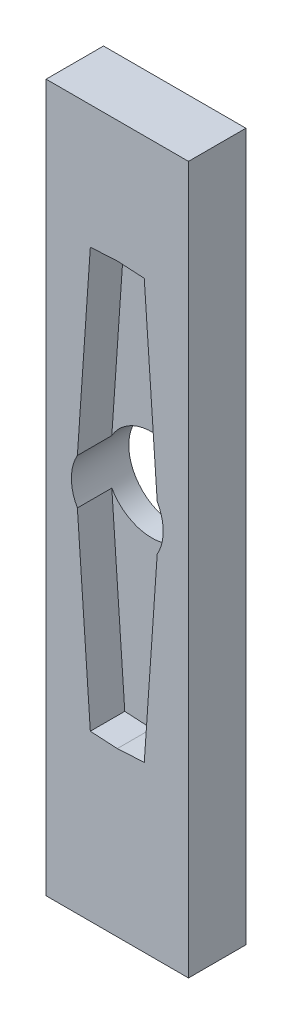
ISO-10303-21;
HEADER;
FILE_DESCRIPTION(('STEP AP214'),'2;1');
FILE_NAME('part.step','',(''),(''),'','','');
FILE_SCHEMA(('AUTOMOTIVE_DESIGN { 1 0 10303 214 1 1 1 1 }'));
ENDSEC;
DATA;
#1=APPLICATION_CONTEXT('core data for automotive mechanical design processes');
#2=APPLICATION_PROTOCOL_DEFINITION('international standard','automotive_design',2000,#1);
#3=PRODUCT_CONTEXT('',#1,'mechanical');
#4=PRODUCT('Part','Part','',(#3));
#5=PRODUCT_RELATED_PRODUCT_CATEGORY('part','',(#4));
#6=PRODUCT_DEFINITION_FORMATION('','',#4);
#7=PRODUCT_DEFINITION_CONTEXT('part definition',#1,'design');
#8=PRODUCT_DEFINITION('design','',#6,#7);
#9=PRODUCT_DEFINITION_SHAPE('','',#8);
#10=(LENGTH_UNIT() NAMED_UNIT(*) SI_UNIT(.MILLI.,.METRE.));
#11=(NAMED_UNIT(*) PLANE_ANGLE_UNIT() SI_UNIT($,.RADIAN.));
#12=(NAMED_UNIT(*) SI_UNIT($,.STERADIAN.) SOLID_ANGLE_UNIT());
#13=UNCERTAINTY_MEASURE_WITH_UNIT(LENGTH_MEASURE(1.E-05),#10,'distance_accuracy_value','');
#14=(GEOMETRIC_REPRESENTATION_CONTEXT(3) GLOBAL_UNCERTAINTY_ASSIGNED_CONTEXT((#13)) GLOBAL_UNIT_ASSIGNED_CONTEXT((#10,
#11,#12)) REPRESENTATION_CONTEXT('',''));
#15=CARTESIAN_POINT('',(0.,0.,0.));
#16=DIRECTION('',(0.,0.,1.));
#17=DIRECTION('',(1.,0.,0.));
#18=AXIS2_PLACEMENT_3D('',#15,#16,#17);
#19=CARTESIAN_POINT('',(0.,0.,-3.));
#20=DIRECTION('',(0.,0.,-1.));
#21=DIRECTION('',(-1.,0.,0.));
#22=AXIS2_PLACEMENT_3D('',#19,#20,#21);
#23=PLANE('',#22);
#24=DIRECTION('',(-0.0691677978064663,-0.997605039956497,0.));
#25=VECTOR('',#24,1.);
#26=CARTESIAN_POINT('',(-3.61380799217099,0.,-3.));
#27=LINE('',#26,#25);
#28=CARTESIAN_POINT('',(-2.34820149974734,18.2538038723774,-3.));
#29=VERTEX_POINT('',#28);
#30=CARTESIAN_POINT('',(-3.47665940987879,1.97808982296084,-3.));
#31=VERTEX_POINT('',#30);
#32=EDGE_CURVE('E319',#29,#31,#27,.T.);
#33=ORIENTED_EDGE('',*,*,#32,.T.);
#34=CARTESIAN_POINT('',(0.,0.,-3.));
#35=DIRECTION('',(0.,0.,-1.));
#36=DIRECTION('',(-1.,0.,0.));
#37=AXIS2_PLACEMENT_3D('',#34,#35,#36);
#38=CIRCLE('',#37,4.);
#39=CARTESIAN_POINT('',(3.47665940987879,1.97808982296084,-3.));
#40=VERTEX_POINT('',#39);
#41=EDGE_CURVE('E11',#31,#40,#38,.T.);
#42=ORIENTED_EDGE('',*,*,#41,.T.);
#43=DIRECTION('',(-0.0691677978064663,0.997605039956497,0.));
#44=VECTOR('',#43,1.);
#45=CARTESIAN_POINT('',(3.61380799217099,0.,-3.));
#46=LINE('',#45,#44);
#47=CARTESIAN_POINT('',(2.34820149974734,18.2538038723774,-3.));
#48=VERTEX_POINT('',#47);
#49=EDGE_CURVE('E162',#40,#48,#46,.T.);
#50=ORIENTED_EDGE('',*,*,#49,.T.);
#51=DIRECTION('',(-0.998375746778421,0.0569725218384344,0.));
#52=VECTOR('',#51,1.);
#53=CARTESIAN_POINT('',(0.,18.3878044845288,-3.));
#54=LINE('',#53,#52);
#55=CARTESIAN_POINT('',(0.,18.3878044845288,-3.));
#56=VERTEX_POINT('',#55);
#57=EDGE_CURVE('E308',#48,#56,#54,.T.);
#58=ORIENTED_EDGE('',*,*,#57,.T.);
#59=DIRECTION('',(-0.998375746778421,-0.0569725218384344,0.));
#60=VECTOR('',#59,1.);
#61=CARTESIAN_POINT('',(0.,18.3878044845288,-3.));
#62=LINE('',#61,#60);
#63=EDGE_CURVE('E315',#56,#29,#62,.T.);
#64=ORIENTED_EDGE('',*,*,#63,.T.);
#65=EDGE_LOOP('',(#33,#42,#50,#58,#64));
#66=FACE_BOUND('',#65,.T.);
#67=ADVANCED_FACE('F39',(#66),#23,.F.);
#68=CARTESIAN_POINT('',(6.2,29.,-5.));
#69=DIRECTION('',(0.,1.,0.));
#70=DIRECTION('',(0.,0.,1.));
#71=AXIS2_PLACEMENT_3D('',#68,#69,#70);
#72=PLANE('',#71);
#73=DIRECTION('',(-1.,0.,0.));
#74=VECTOR('',#73,1.);
#75=CARTESIAN_POINT('',(6.2,29.,0.));
#76=LINE('',#75,#74);
#77=CARTESIAN_POINT('',(6.2,29.,0.));
#78=VERTEX_POINT('',#77);
#79=CARTESIAN_POINT('',(-6.2,29.,0.));
#80=VERTEX_POINT('',#79);
#81=EDGE_CURVE('E225',#78,#80,#76,.T.);
#82=ORIENTED_EDGE('',*,*,#81,.F.);
#83=DIRECTION('',(0.,0.,1.));
#84=VECTOR('',#83,1.);
#85=CARTESIAN_POINT('',(6.2,29.,-5.));
#86=LINE('',#85,#84);
#87=CARTESIAN_POINT('',(6.2,29.,-5.));
#88=VERTEX_POINT('',#87);
#89=EDGE_CURVE('E252',#88,#78,#86,.T.);
#90=ORIENTED_EDGE('',*,*,#89,.F.);
#91=DIRECTION('',(-1.,0.,0.));
#92=VECTOR('',#91,1.);
#93=CARTESIAN_POINT('',(6.2,29.,-5.));
#94=LINE('',#93,#92);
#95=CARTESIAN_POINT('',(-6.2,29.,-5.));
#96=VERTEX_POINT('',#95);
#97=EDGE_CURVE('E232',#88,#96,#94,.T.);
#98=ORIENTED_EDGE('',*,*,#97,.T.);
#99=DIRECTION('',(0.,0.,1.));
#100=VECTOR('',#99,1.);
#101=CARTESIAN_POINT('',(-6.2,29.,-5.));
#102=LINE('',#101,#100);
#103=EDGE_CURVE('E64',#96,#80,#102,.T.);
#104=ORIENTED_EDGE('',*,*,#103,.T.);
#105=EDGE_LOOP('',(#82,#90,#98,#104));
#106=FACE_BOUND('',#105,.T.);
#107=ADVANCED_FACE('F266',(#106),#72,.T.);
#108=CARTESIAN_POINT('',(6.2,-29.,-5.));
#109=DIRECTION('',(1.,0.,0.));
#110=DIRECTION('',(0.,0.,-1.));
#111=AXIS2_PLACEMENT_3D('',#108,#109,#110);
#112=PLANE('',#111);
#113=DIRECTION('',(0.,1.,0.));
#114=VECTOR('',#113,1.);
#115=CARTESIAN_POINT('',(6.2,-29.,0.));
#116=LINE('',#115,#114);
#117=CARTESIAN_POINT('',(6.2,-32.59,0.));
#118=VERTEX_POINT('',#117);
#119=EDGE_CURVE('E243',#118,#78,#116,.T.);
#120=ORIENTED_EDGE('',*,*,#119,.F.);
#121=DIRECTION('',(0.,0.,1.));
#122=VECTOR('',#121,1.);
#123=CARTESIAN_POINT('',(6.2,-32.59,-5.));
#124=LINE('',#123,#122);
#125=CARTESIAN_POINT('',(6.2,-32.59,-5.));
#126=VERTEX_POINT('',#125);
#127=EDGE_CURVE('E255',#126,#118,#124,.T.);
#128=ORIENTED_EDGE('',*,*,#127,.F.);
#129=DIRECTION('',(0.,1.,0.));
#130=VECTOR('',#129,1.);
#131=CARTESIAN_POINT('',(6.2,-29.,-5.));
#132=LINE('',#131,#130);
#133=EDGE_CURVE('E229',#126,#88,#132,.T.);
#134=ORIENTED_EDGE('',*,*,#133,.T.);
#135=ORIENTED_EDGE('',*,*,#89,.T.);
#136=EDGE_LOOP('',(#120,#128,#134,#135));
#137=FACE_BOUND('',#136,.T.);
#138=ADVANCED_FACE('F272',(#137),#112,.T.);
#139=CARTESIAN_POINT('',(6.2,-32.59,-5.));
#140=DIRECTION('',(0.,-1.,0.));
#141=DIRECTION('',(0.,0.,-1.));
#142=AXIS2_PLACEMENT_3D('',#139,#140,#141);
#143=PLANE('',#142);
#144=DIRECTION('',(1.,0.,0.));
#145=VECTOR('',#144,1.);
#146=CARTESIAN_POINT('',(6.2,-32.59,0.));
#147=LINE('',#146,#145);
#148=CARTESIAN_POINT('',(-6.2,-32.59,0.));
#149=VERTEX_POINT('',#148);
#150=EDGE_CURVE('E239',#149,#118,#147,.T.);
#151=ORIENTED_EDGE('',*,*,#150,.F.);
#152=DIRECTION('',(0.,0.,1.));
#153=VECTOR('',#152,1.);
#154=CARTESIAN_POINT('',(-6.2,-32.59,-5.));
#155=LINE('',#154,#153);
#156=CARTESIAN_POINT('',(-6.2,-32.59,-5.));
#157=VERTEX_POINT('',#156);
#158=EDGE_CURVE('E236',#157,#149,#155,.T.);
#159=ORIENTED_EDGE('',*,*,#158,.F.);
#160=DIRECTION('',(1.,0.,0.));
#161=VECTOR('',#160,1.);
#162=CARTESIAN_POINT('',(6.2,-32.59,-5.));
#163=LINE('',#162,#161);
#164=EDGE_CURVE('E224',#157,#126,#163,.T.);
#165=ORIENTED_EDGE('',*,*,#164,.T.);
#166=ORIENTED_EDGE('',*,*,#127,.T.);
#167=EDGE_LOOP('',(#151,#159,#165,#166));
#168=FACE_BOUND('',#167,.T.);
#169=ADVANCED_FACE('F262',(#168),#143,.T.);
#170=CARTESIAN_POINT('',(-6.2,-32.59,-5.));
#171=DIRECTION('',(-1.,0.,0.));
#172=DIRECTION('',(0.,0.,1.));
#173=AXIS2_PLACEMENT_3D('',#170,#171,#172);
#174=PLANE('',#173);
#175=DIRECTION('',(0.,-1.,0.));
#176=VECTOR('',#175,1.);
#177=CARTESIAN_POINT('',(-6.2,-32.59,0.));
#178=LINE('',#177,#176);
#179=EDGE_CURVE('E83',#80,#149,#178,.T.);
#180=ORIENTED_EDGE('',*,*,#179,.F.);
#181=ORIENTED_EDGE('',*,*,#103,.F.);
#182=DIRECTION('',(0.,-1.,0.));
#183=VECTOR('',#182,1.);
#184=CARTESIAN_POINT('',(-6.2,-29.,-5.));
#185=LINE('',#184,#183);
#186=EDGE_CURVE('E85',#96,#157,#185,.T.);
#187=ORIENTED_EDGE('',*,*,#186,.T.);
#188=ORIENTED_EDGE('',*,*,#158,.T.);
#189=EDGE_LOOP('',(#180,#181,#187,#188));
#190=FACE_BOUND('',#189,.T.);
#191=ADVANCED_FACE('F41',(#190),#174,.T.);
#192=CARTESIAN_POINT('',(0.,0.,-5.));
#193=DIRECTION('',(0.,0.,1.));
#194=DIRECTION('',(1.,0.,0.));
#195=AXIS2_PLACEMENT_3D('',#192,#193,#194);
#196=PLANE('',#195);
#197=CARTESIAN_POINT('',(0.,0.,-5.));
#198=DIRECTION('',(0.,0.,1.));
#199=DIRECTION('',(1.,0.,0.));
#200=AXIS2_PLACEMENT_3D('',#197,#198,#199);
#201=CIRCLE('',#200,4.);
#202=CARTESIAN_POINT('',(4.,0.,-5.));
#203=VERTEX_POINT('',#202);
#204=EDGE_CURVE('E341',#203,#203,#201,.T.);
#205=ORIENTED_EDGE('',*,*,#204,.T.);
#206=EDGE_LOOP('',(#205));
#207=FACE_BOUND('',#206,.T.);
#208=ORIENTED_EDGE('',*,*,#186,.F.);
#209=ORIENTED_EDGE('',*,*,#97,.F.);
#210=ORIENTED_EDGE('',*,*,#133,.F.);
#211=ORIENTED_EDGE('',*,*,#164,.F.);
#212=EDGE_LOOP('',(#208,#209,#210,#211));
#213=FACE_BOUND('',#212,.T.);
#214=ADVANCED_FACE('F270',(#207,#213),#196,.F.);
#215=CARTESIAN_POINT('',(0.,0.,0.));
#216=DIRECTION('',(0.,0.,1.));
#217=DIRECTION('',(1.,0.,0.));
#218=AXIS2_PLACEMENT_3D('',#215,#216,#217);
#219=PLANE('',#218);
#220=CARTESIAN_POINT('',(0.,0.,0.));
#221=DIRECTION('',(0.,0.,1.));
#222=DIRECTION('',(1.,0.,0.));
#223=AXIS2_PLACEMENT_3D('',#220,#221,#222);
#224=CIRCLE('',#223,4.);
#225=CARTESIAN_POINT('',(-3.47665940987879,1.97808982296084,0.));
#226=VERTEX_POINT('',#225);
#227=CARTESIAN_POINT('',(-3.47665940987879,-1.97808982296084,0.));
#228=VERTEX_POINT('',#227);
#229=EDGE_CURVE('E154',#226,#228,#224,.T.);
#230=ORIENTED_EDGE('',*,*,#229,.F.);
#231=DIRECTION('',(-0.0691677978064663,-0.997605039956497,0.));
#232=VECTOR('',#231,1.);
#233=CARTESIAN_POINT('',(-3.61380799217099,0.,0.));
#234=LINE('',#233,#232);
#235=CARTESIAN_POINT('',(-2.34820149974734,18.2538038723774,0.));
#236=VERTEX_POINT('',#235);
#237=EDGE_CURVE('E186',#236,#226,#234,.T.);
#238=ORIENTED_EDGE('',*,*,#237,.F.);
#239=DIRECTION('',(-0.998375746778421,-0.0569725218384344,0.));
#240=VECTOR('',#239,1.);
#241=CARTESIAN_POINT('',(0.,18.3878044845288,0.));
#242=LINE('',#241,#240);
#243=CARTESIAN_POINT('',(0.,18.3878044845288,0.));
#244=VERTEX_POINT('',#243);
#245=EDGE_CURVE('E178',#244,#236,#242,.T.);
#246=ORIENTED_EDGE('',*,*,#245,.F.);
#247=DIRECTION('',(-0.998375746778421,0.0569725218384344,0.));
#248=VECTOR('',#247,1.);
#249=CARTESIAN_POINT('',(0.,18.3878044845288,0.));
#250=LINE('',#249,#248);
#251=CARTESIAN_POINT('',(2.34820149974734,18.2538038723774,0.));
#252=VERTEX_POINT('',#251);
#253=EDGE_CURVE('E172',#252,#244,#250,.T.);
#254=ORIENTED_EDGE('',*,*,#253,.F.);
#255=DIRECTION('',(-0.0691677978064663,0.997605039956497,0.));
#256=VECTOR('',#255,1.);
#257=CARTESIAN_POINT('',(3.61380799217099,0.,0.));
#258=LINE('',#257,#256);
#259=CARTESIAN_POINT('',(3.47665940987879,1.97808982296084,0.));
#260=VERTEX_POINT('',#259);
#261=EDGE_CURVE('E160',#260,#252,#258,.T.);
#262=ORIENTED_EDGE('',*,*,#261,.F.);
#263=CARTESIAN_POINT('',(3.47665940987879,-1.97808982296084,0.));
#264=VERTEX_POINT('',#263);
#265=EDGE_CURVE('E143',#264,#260,#224,.T.);
#266=ORIENTED_EDGE('',*,*,#265,.F.);
#267=DIRECTION('',(0.0691677978064663,0.997605039956497,0.));
#268=VECTOR('',#267,1.);
#269=CARTESIAN_POINT('',(3.61380799217099,0.,0.));
#270=LINE('',#269,#268);
#271=CARTESIAN_POINT('',(2.34820149974734,-18.2538038723774,0.));
#272=VERTEX_POINT('',#271);
#273=EDGE_CURVE('E174',#272,#264,#270,.T.);
#274=ORIENTED_EDGE('',*,*,#273,.F.);
#275=DIRECTION('',(0.998375746778421,0.0569725218384344,0.));
#276=VECTOR('',#275,1.);
#277=CARTESIAN_POINT('',(0.,-18.3878044845288,0.));
#278=LINE('',#277,#276);
#279=CARTESIAN_POINT('',(0.,-18.3878044845288,0.));
#280=VERTEX_POINT('',#279);
#281=EDGE_CURVE('E197',#280,#272,#278,.T.);
#282=ORIENTED_EDGE('',*,*,#281,.F.);
#283=DIRECTION('',(0.998375746778421,-0.0569725218384344,0.));
#284=VECTOR('',#283,1.);
#285=CARTESIAN_POINT('',(0.,-18.3878044845288,0.));
#286=LINE('',#285,#284);
#287=CARTESIAN_POINT('',(-2.34820149974734,-18.2538038723774,0.));
#288=VERTEX_POINT('',#287);
#289=EDGE_CURVE('E193',#288,#280,#286,.T.);
#290=ORIENTED_EDGE('',*,*,#289,.F.);
#291=DIRECTION('',(0.0691677978064663,-0.997605039956497,0.));
#292=VECTOR('',#291,1.);
#293=CARTESIAN_POINT('',(-3.61380799217099,0.,0.));
#294=LINE('',#293,#292);
#295=EDGE_CURVE('E190',#228,#288,#294,.T.);
#296=ORIENTED_EDGE('',*,*,#295,.F.);
#297=EDGE_LOOP('',(#230,#238,#246,#254,#262,#266,#274,#282,#290,#296));
#298=FACE_BOUND('',#297,.T.);
#299=ORIENTED_EDGE('',*,*,#81,.T.);
#300=ORIENTED_EDGE('',*,*,#179,.T.);
#301=ORIENTED_EDGE('',*,*,#150,.T.);
#302=ORIENTED_EDGE('',*,*,#119,.T.);
#303=EDGE_LOOP('',(#299,#300,#301,#302));
#304=FACE_BOUND('',#303,.T.);
#305=ADVANCED_FACE('F168',(#298,#304),#219,.T.);
#306=CARTESIAN_POINT('',(3.61380799217099,0.,-3.));
#307=DIRECTION('',(0.997605039956497,-0.0691677978064663,0.));
#308=DIRECTION('',(0.0691677978064663,0.997605039956497,0.));
#309=AXIS2_PLACEMENT_3D('',#306,#307,#308);
#310=PLANE('',#309);
#311=ORIENTED_EDGE('',*,*,#273,.T.);
#312=DIRECTION('',(0.,0.,1.));
#313=VECTOR('',#312,1.);
#314=CARTESIAN_POINT('',(3.47665940987879,-1.97808982296084,-5.));
#315=LINE('',#314,#313);
#316=CARTESIAN_POINT('',(3.47665940987879,-1.97808982296084,-3.));
#317=VERTEX_POINT('',#316);
#318=EDGE_CURVE('E148',#264,#317,#315,.F.);
#319=ORIENTED_EDGE('',*,*,#318,.T.);
#320=DIRECTION('',(0.0691677978064663,0.997605039956497,0.));
#321=VECTOR('',#320,1.);
#322=CARTESIAN_POINT('',(3.61380799217099,0.,-3.));
#323=LINE('',#322,#321);
#324=CARTESIAN_POINT('',(2.34820149974734,-18.2538038723774,-3.));
#325=VERTEX_POINT('',#324);
#326=EDGE_CURVE('E201',#325,#317,#323,.T.);
#327=ORIENTED_EDGE('',*,*,#326,.F.);
#328=DIRECTION('',(0.,0.,1.));
#329=VECTOR('',#328,1.);
#330=CARTESIAN_POINT('',(2.34820149974734,-18.2538038723774,-3.));
#331=LINE('',#330,#329);
#332=EDGE_CURVE('E202',#325,#272,#331,.T.);
#333=ORIENTED_EDGE('',*,*,#332,.T.);
#334=EDGE_LOOP('',(#311,#319,#327,#333));
#335=FACE_BOUND('',#334,.T.);
#336=ADVANCED_FACE('F334',(#335),#310,.F.);
#337=CARTESIAN_POINT('',(0.,-18.3878044845288,-3.));
#338=DIRECTION('',(0.0569725218384344,-0.998375746778421,0.));
#339=DIRECTION('',(0.998375746778421,0.0569725218384344,0.));
#340=AXIS2_PLACEMENT_3D('',#337,#338,#339);
#341=PLANE('',#340);
#342=ORIENTED_EDGE('',*,*,#281,.T.);
#343=ORIENTED_EDGE('',*,*,#332,.F.);
#344=DIRECTION('',(0.998375746778421,0.0569725218384344,0.));
#345=VECTOR('',#344,1.);
#346=CARTESIAN_POINT('',(0.,-18.3878044845288,-3.));
#347=LINE('',#346,#345);
#348=CARTESIAN_POINT('',(0.,-18.3878044845288,-3.));
#349=VERTEX_POINT('',#348);
#350=EDGE_CURVE('E221',#349,#325,#347,.T.);
#351=ORIENTED_EDGE('',*,*,#350,.F.);
#352=DIRECTION('',(0.,0.,1.));
#353=VECTOR('',#352,1.);
#354=CARTESIAN_POINT('',(0.,-18.3878044845288,-3.));
#355=LINE('',#354,#353);
#356=EDGE_CURVE('E205',#349,#280,#355,.T.);
#357=ORIENTED_EDGE('',*,*,#356,.T.);
#358=EDGE_LOOP('',(#342,#343,#351,#357));
#359=FACE_BOUND('',#358,.T.);
#360=ADVANCED_FACE('F332',(#359),#341,.F.);
#361=CARTESIAN_POINT('',(0.,-18.3878044845288,-3.));
#362=DIRECTION('',(-0.0569725218384344,-0.998375746778421,0.));
#363=DIRECTION('',(0.998375746778421,-0.0569725218384344,0.));
#364=AXIS2_PLACEMENT_3D('',#361,#362,#363);
#365=PLANE('',#364);
#366=ORIENTED_EDGE('',*,*,#289,.T.);
#367=ORIENTED_EDGE('',*,*,#356,.F.);
#368=DIRECTION('',(0.998375746778421,-0.0569725218384344,0.));
#369=VECTOR('',#368,1.);
#370=CARTESIAN_POINT('',(0.,-18.3878044845288,-3.));
#371=LINE('',#370,#369);
#372=CARTESIAN_POINT('',(-2.34820149974734,-18.2538038723774,-3.));
#373=VERTEX_POINT('',#372);
#374=EDGE_CURVE('E325',#373,#349,#371,.T.);
#375=ORIENTED_EDGE('',*,*,#374,.F.);
#376=DIRECTION('',(0.,0.,1.));
#377=VECTOR('',#376,1.);
#378=CARTESIAN_POINT('',(-2.34820149974734,-18.2538038723774,-3.));
#379=LINE('',#378,#377);
#380=EDGE_CURVE('E208',#373,#288,#379,.T.);
#381=ORIENTED_EDGE('',*,*,#380,.T.);
#382=EDGE_LOOP('',(#366,#367,#375,#381));
#383=FACE_BOUND('',#382,.T.);
#384=ADVANCED_FACE('F337',(#383),#365,.F.);
#385=CARTESIAN_POINT('',(-3.61380799217099,0.,-3.));
#386=DIRECTION('',(-0.997605039956497,-0.0691677978064663,0.));
#387=DIRECTION('',(0.0691677978064663,-0.997605039956497,0.));
#388=AXIS2_PLACEMENT_3D('',#385,#386,#387);
#389=PLANE('',#388);
#390=DIRECTION('',(0.0691677978064663,-0.997605039956497,0.));
#391=VECTOR('',#390,1.);
#392=CARTESIAN_POINT('',(-3.61380799217099,0.,-3.));
#393=LINE('',#392,#391);
#394=CARTESIAN_POINT('',(-3.47665940987879,-1.97808982296084,-3.));
#395=VERTEX_POINT('',#394);
#396=EDGE_CURVE('E322',#395,#373,#393,.T.);
#397=ORIENTED_EDGE('',*,*,#396,.F.);
#398=DIRECTION('',(0.,0.,1.));
#399=VECTOR('',#398,1.);
#400=CARTESIAN_POINT('',(-3.47665940987879,-1.97808982296084,-5.));
#401=LINE('',#400,#399);
#402=EDGE_CURVE('E55',#395,#228,#401,.T.);
#403=ORIENTED_EDGE('',*,*,#402,.T.);
#404=ORIENTED_EDGE('',*,*,#295,.T.);
#405=ORIENTED_EDGE('',*,*,#380,.F.);
#406=EDGE_LOOP('',(#397,#403,#404,#405));
#407=FACE_BOUND('',#406,.T.);
#408=ADVANCED_FACE('F339',(#407),#389,.F.);
#409=CARTESIAN_POINT('',(-3.61380799217099,0.,-3.));
#410=DIRECTION('',(-0.997605039956497,0.0691677978064663,0.));
#411=DIRECTION('',(-0.0691677978064663,-0.997605039956497,0.));
#412=AXIS2_PLACEMENT_3D('',#409,#410,#411);
#413=PLANE('',#412);
#414=ORIENTED_EDGE('',*,*,#237,.T.);
#415=DIRECTION('',(0.,0.,1.));
#416=VECTOR('',#415,1.);
#417=CARTESIAN_POINT('',(-3.47665940987879,1.97808982296084,-5.));
#418=LINE('',#417,#416);
#419=EDGE_CURVE('E164',#226,#31,#418,.F.);
#420=ORIENTED_EDGE('',*,*,#419,.T.);
#421=ORIENTED_EDGE('',*,*,#32,.F.);
#422=DIRECTION('',(0.,0.,1.));
#423=VECTOR('',#422,1.);
#424=CARTESIAN_POINT('',(-2.34820149974734,18.2538038723774,-3.));
#425=LINE('',#424,#423);
#426=EDGE_CURVE('E212',#29,#236,#425,.T.);
#427=ORIENTED_EDGE('',*,*,#426,.T.);
#428=EDGE_LOOP('',(#414,#420,#421,#427));
#429=FACE_BOUND('',#428,.T.);
#430=ADVANCED_FACE('F354',(#429),#413,.F.);
#431=CARTESIAN_POINT('',(0.,18.3878044845288,-3.));
#432=DIRECTION('',(-0.0569725218384344,0.998375746778421,0.));
#433=DIRECTION('',(-0.998375746778421,-0.0569725218384344,0.));
#434=AXIS2_PLACEMENT_3D('',#431,#432,#433);
#435=PLANE('',#434);
#436=ORIENTED_EDGE('',*,*,#245,.T.);
#437=ORIENTED_EDGE('',*,*,#426,.F.);
#438=ORIENTED_EDGE('',*,*,#63,.F.);
#439=DIRECTION('',(0.,0.,1.));
#440=VECTOR('',#439,1.);
#441=CARTESIAN_POINT('',(0.,18.3878044845288,-3.));
#442=LINE('',#441,#440);
#443=EDGE_CURVE('E215',#56,#244,#442,.T.);
#444=ORIENTED_EDGE('',*,*,#443,.T.);
#445=EDGE_LOOP('',(#436,#437,#438,#444));
#446=FACE_BOUND('',#445,.T.);
#447=ADVANCED_FACE('F358',(#446),#435,.F.);
#448=CARTESIAN_POINT('',(0.,18.3878044845288,-3.));
#449=DIRECTION('',(0.0569725218384344,0.998375746778421,0.));
#450=DIRECTION('',(-0.998375746778421,0.0569725218384344,0.));
#451=AXIS2_PLACEMENT_3D('',#448,#449,#450);
#452=PLANE('',#451);
#453=ORIENTED_EDGE('',*,*,#253,.T.);
#454=ORIENTED_EDGE('',*,*,#443,.F.);
#455=ORIENTED_EDGE('',*,*,#57,.F.);
#456=DIRECTION('',(0.,0.,1.));
#457=VECTOR('',#456,1.);
#458=CARTESIAN_POINT('',(2.34820149974734,18.2538038723774,-3.));
#459=LINE('',#458,#457);
#460=EDGE_CURVE('E218',#48,#252,#459,.T.);
#461=ORIENTED_EDGE('',*,*,#460,.T.);
#462=EDGE_LOOP('',(#453,#454,#455,#461));
#463=FACE_BOUND('',#462,.T.);
#464=ADVANCED_FACE('F296',(#463),#452,.F.);
#465=CARTESIAN_POINT('',(3.61380799217099,0.,-3.));
#466=DIRECTION('',(0.997605039956497,0.0691677978064663,0.));
#467=DIRECTION('',(-0.0691677978064663,0.997605039956497,0.));
#468=AXIS2_PLACEMENT_3D('',#465,#466,#467);
#469=PLANE('',#468);
#470=ORIENTED_EDGE('',*,*,#49,.F.);
#471=DIRECTION('',(0.,0.,1.));
#472=VECTOR('',#471,1.);
#473=CARTESIAN_POINT('',(3.47665940987879,1.97808982296084,-5.));
#474=LINE('',#473,#472);
#475=EDGE_CURVE('E146',#40,#260,#474,.T.);
#476=ORIENTED_EDGE('',*,*,#475,.T.);
#477=ORIENTED_EDGE('',*,*,#261,.T.);
#478=ORIENTED_EDGE('',*,*,#460,.F.);
#479=EDGE_LOOP('',(#470,#476,#477,#478));
#480=FACE_BOUND('',#479,.T.);
#481=ADVANCED_FACE('F158',(#480),#469,.F.);
#482=ORIENTED_EDGE('',*,*,#326,.T.);
#483=EDGE_CURVE('E43',#317,#395,#38,.T.);
#484=ORIENTED_EDGE('',*,*,#483,.T.);
#485=ORIENTED_EDGE('',*,*,#396,.T.);
#486=ORIENTED_EDGE('',*,*,#374,.T.);
#487=ORIENTED_EDGE('',*,*,#350,.T.);
#488=EDGE_LOOP('',(#482,#484,#485,#486,#487));
#489=FACE_BOUND('',#488,.T.);
#490=ADVANCED_FACE('F283',(#489),#23,.F.);
#491=CARTESIAN_POINT('',(0.,0.,-5.));
#492=DIRECTION('',(0.,0.,1.));
#493=DIRECTION('',(1.,0.,0.));
#494=AXIS2_PLACEMENT_3D('',#491,#492,#493);
#495=CYLINDRICAL_SURFACE('',#494,4.);
#496=ORIENTED_EDGE('',*,*,#204,.F.);
#497=EDGE_LOOP('',(#496));
#498=FACE_BOUND('',#497,.T.);
#499=ORIENTED_EDGE('',*,*,#229,.T.);
#500=ORIENTED_EDGE('',*,*,#402,.F.);
#501=ORIENTED_EDGE('',*,*,#483,.F.);
#502=ORIENTED_EDGE('',*,*,#318,.F.);
#503=ORIENTED_EDGE('',*,*,#265,.T.);
#504=ORIENTED_EDGE('',*,*,#475,.F.);
#505=ORIENTED_EDGE('',*,*,#41,.F.);
#506=ORIENTED_EDGE('',*,*,#419,.F.);
#507=EDGE_LOOP('',(#499,#500,#501,#502,#503,#504,#505,#506));
#508=FACE_BOUND('',#507,.T.);
#509=ADVANCED_FACE('F145',(#498,#508),#495,.F.);
#510=CLOSED_SHELL('',(#67,#107,#138,#169,#191,#214,#305,#336,#360,#384,#408,#430,#447,#464,#481,
#490,#509));
#511=MANIFOLD_SOLID_BREP('B2',#510);
#512=ADVANCED_BREP_SHAPE_REPRESENTATION('',(#18,#511),#14);
#513=SHAPE_DEFINITION_REPRESENTATION(#9,#512);
ENDSEC;
END-ISO-10303-21;
